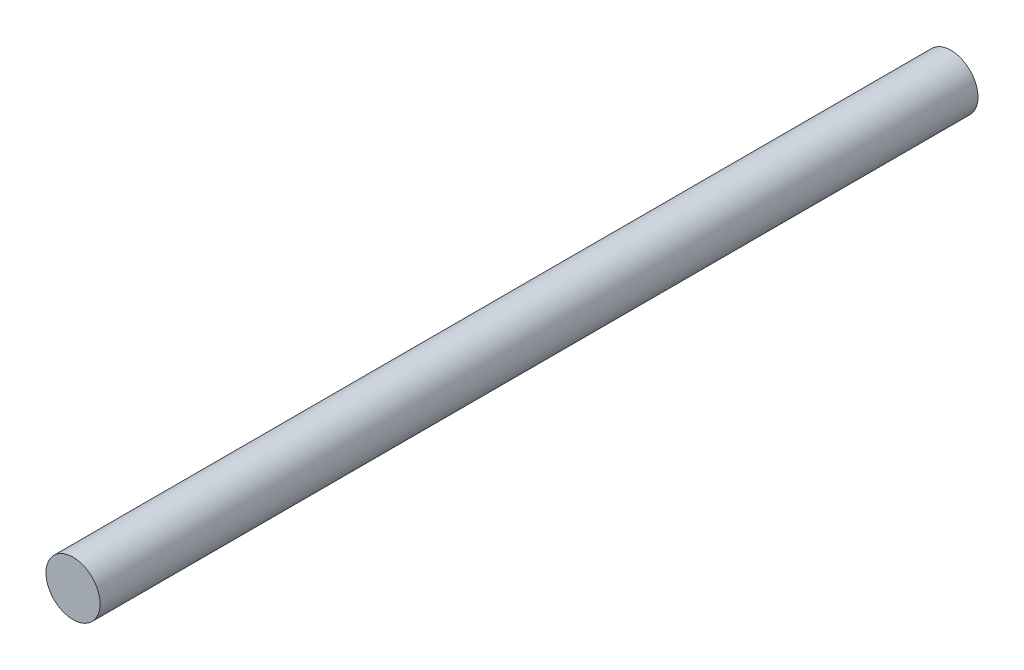
ISO-10303-21;
HEADER;
FILE_DESCRIPTION(('STEP AP214'),'2;1');
FILE_NAME('part.step','',(''),(''),'','','');
FILE_SCHEMA(('AUTOMOTIVE_DESIGN { 1 0 10303 214 1 1 1 1 }'));
ENDSEC;
DATA;
#1=APPLICATION_CONTEXT('core data for automotive mechanical design processes');
#2=APPLICATION_PROTOCOL_DEFINITION('international standard','automotive_design',2000,#1);
#3=PRODUCT_CONTEXT('',#1,'mechanical');
#4=PRODUCT('Part','Part','',(#3));
#5=PRODUCT_RELATED_PRODUCT_CATEGORY('part','',(#4));
#6=PRODUCT_DEFINITION_FORMATION('','',#4);
#7=PRODUCT_DEFINITION_CONTEXT('part definition',#1,'design');
#8=PRODUCT_DEFINITION('design','',#6,#7);
#9=PRODUCT_DEFINITION_SHAPE('','',#8);
#10=(LENGTH_UNIT() NAMED_UNIT(*) SI_UNIT(.MILLI.,.METRE.));
#11=(NAMED_UNIT(*) PLANE_ANGLE_UNIT() SI_UNIT($,.RADIAN.));
#12=(NAMED_UNIT(*) SI_UNIT($,.STERADIAN.) SOLID_ANGLE_UNIT());
#13=UNCERTAINTY_MEASURE_WITH_UNIT(LENGTH_MEASURE(1.E-05),#10,'distance_accuracy_value','');
#14=(GEOMETRIC_REPRESENTATION_CONTEXT(3) GLOBAL_UNCERTAINTY_ASSIGNED_CONTEXT((#13)) GLOBAL_UNIT_ASSIGNED_CONTEXT((#10,
#11,#12)) REPRESENTATION_CONTEXT('',''));
#15=CARTESIAN_POINT('',(0.,0.,0.));
#16=DIRECTION('',(0.,0.,1.));
#17=DIRECTION('',(1.,0.,0.));
#18=AXIS2_PLACEMENT_3D('',#15,#16,#17);
#19=CARTESIAN_POINT('',(0.,0.,114.270562748477));
#20=DIRECTION('',(0.,0.,-1.));
#21=DIRECTION('',(-1.,0.,0.));
#22=AXIS2_PLACEMENT_3D('',#19,#20,#21);
#23=CYLINDRICAL_SURFACE('',#22,6.);
#24=CARTESIAN_POINT('',(0.,0.,97.3));
#25=DIRECTION('',(0.,0.,1.));
#26=DIRECTION('',(1.,0.,0.));
#27=AXIS2_PLACEMENT_3D('',#24,#25,#26);
#28=CIRCLE('',#27,6.);
#29=CARTESIAN_POINT('',(6.,0.,97.3));
#30=VERTEX_POINT('',#29);
#31=EDGE_CURVE('E10',#30,#30,#28,.T.);
#32=ORIENTED_EDGE('',*,*,#31,.F.);
#33=EDGE_LOOP('',(#32));
#34=FACE_BOUND('',#33,.T.);
#35=CARTESIAN_POINT('',(0.,0.,-97.3));
#36=DIRECTION('',(0.,0.,1.));
#37=DIRECTION('',(1.,0.,0.));
#38=AXIS2_PLACEMENT_3D('',#35,#36,#37);
#39=CIRCLE('',#38,6.);
#40=CARTESIAN_POINT('',(6.,0.,-97.3));
#41=VERTEX_POINT('',#40);
#42=EDGE_CURVE('E40',#41,#41,#39,.T.);
#43=ORIENTED_EDGE('',*,*,#42,.T.);
#44=EDGE_LOOP('',(#43));
#45=FACE_BOUND('',#44,.T.);
#46=ADVANCED_FACE('F33',(#34,#45),#23,.T.);
#47=CARTESIAN_POINT('',(0.,-144.,97.3));
#48=DIRECTION('',(0.,0.,1.));
#49=DIRECTION('',(1.,0.,0.));
#50=AXIS2_PLACEMENT_3D('',#47,#48,#49);
#51=PLANE('',#50);
#52=ORIENTED_EDGE('',*,*,#31,.T.);
#53=EDGE_LOOP('',(#52));
#54=FACE_BOUND('',#53,.T.);
#55=ADVANCED_FACE('F35',(#54),#51,.T.);
#56=CARTESIAN_POINT('',(0.,-144.,-97.3));
#57=DIRECTION('',(0.,0.,-1.));
#58=DIRECTION('',(1.,0.,0.));
#59=AXIS2_PLACEMENT_3D('',#56,#57,#58);
#60=PLANE('',#59);
#61=ORIENTED_EDGE('',*,*,#42,.F.);
#62=EDGE_LOOP('',(#61));
#63=FACE_BOUND('',#62,.T.);
#64=ADVANCED_FACE('F47',(#63),#60,.T.);
#65=CLOSED_SHELL('',(#46,#55,#64));
#66=MANIFOLD_SOLID_BREP('B2',#65);
#67=ADVANCED_BREP_SHAPE_REPRESENTATION('',(#18,#66),#14);
#68=SHAPE_DEFINITION_REPRESENTATION(#9,#67);
ENDSEC;
END-ISO-10303-21;
